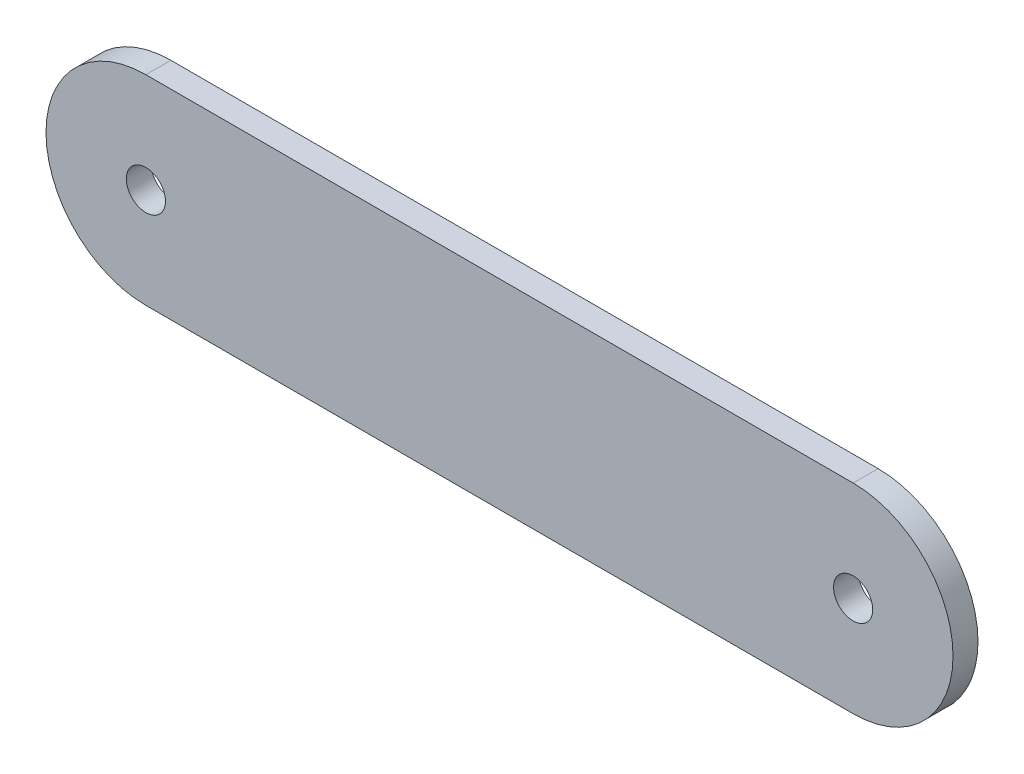
ISO-10303-21;
HEADER;
FILE_DESCRIPTION(('STEP AP214'),'2;1');
FILE_NAME('part.step','',(''),(''),'','','');
FILE_SCHEMA(('AUTOMOTIVE_DESIGN { 1 0 10303 214 1 1 1 1 }'));
ENDSEC;
DATA;
#1=APPLICATION_CONTEXT('core data for automotive mechanical design processes');
#2=APPLICATION_PROTOCOL_DEFINITION('international standard','automotive_design',2000,#1);
#3=PRODUCT_CONTEXT('',#1,'mechanical');
#4=PRODUCT('Part','Part','',(#3));
#5=PRODUCT_RELATED_PRODUCT_CATEGORY('part','',(#4));
#6=PRODUCT_DEFINITION_FORMATION('','',#4);
#7=PRODUCT_DEFINITION_CONTEXT('part definition',#1,'design');
#8=PRODUCT_DEFINITION('design','',#6,#7);
#9=PRODUCT_DEFINITION_SHAPE('','',#8);
#10=(LENGTH_UNIT() NAMED_UNIT(*) SI_UNIT(.MILLI.,.METRE.));
#11=(NAMED_UNIT(*) PLANE_ANGLE_UNIT() SI_UNIT($,.RADIAN.));
#12=(NAMED_UNIT(*) SI_UNIT($,.STERADIAN.) SOLID_ANGLE_UNIT());
#13=UNCERTAINTY_MEASURE_WITH_UNIT(LENGTH_MEASURE(1.E-05),#10,'distance_accuracy_value','');
#14=(GEOMETRIC_REPRESENTATION_CONTEXT(3) GLOBAL_UNCERTAINTY_ASSIGNED_CONTEXT((#13)) GLOBAL_UNIT_ASSIGNED_CONTEXT((#10,
#11,#12)) REPRESENTATION_CONTEXT('',''));
#15=CARTESIAN_POINT('',(0.,0.,0.));
#16=DIRECTION('',(0.,0.,1.));
#17=DIRECTION('',(1.,0.,0.));
#18=AXIS2_PLACEMENT_3D('',#15,#16,#17);
#19=CARTESIAN_POINT('',(49.1513028257687,-1.99820795430557E-13,3.175));
#20=DIRECTION('',(0.,0.,-1.));
#21=DIRECTION('',(-1.,0.,0.));
#22=AXIS2_PLACEMENT_3D('',#19,#20,#21);
#23=CYLINDRICAL_SURFACE('',#22,12.7000000000002);
#24=CARTESIAN_POINT('',(49.1513028257687,-1.99820795430557E-13,0.));
#25=DIRECTION('',(0.,0.,1.));
#26=DIRECTION('',(1.,0.,0.));
#27=AXIS2_PLACEMENT_3D('',#24,#25,#26);
#28=CIRCLE('',#27,12.7000000000002);
#29=CARTESIAN_POINT('',(49.1512996272687,-12.7,0.));
#30=VERTEX_POINT('',#29);
#31=CARTESIAN_POINT('',(49.1513028257687,12.7,0.));
#32=VERTEX_POINT('',#31);
#33=EDGE_CURVE('E113',#30,#32,#28,.T.);
#34=ORIENTED_EDGE('',*,*,#33,.T.);
#35=DIRECTION('',(0.,0.,-1.));
#36=VECTOR('',#35,1.);
#37=CARTESIAN_POINT('',(49.1513028257687,12.7,3.175));
#38=LINE('',#37,#36);
#39=CARTESIAN_POINT('',(49.1513028257687,12.7,3.175));
#40=VERTEX_POINT('',#39);
#41=EDGE_CURVE('E11',#40,#32,#38,.T.);
#42=ORIENTED_EDGE('',*,*,#41,.F.);
#43=CARTESIAN_POINT('',(49.1513028257687,-1.99820795430557E-13,3.175));
#44=DIRECTION('',(0.,0.,1.));
#45=DIRECTION('',(1.,0.,0.));
#46=AXIS2_PLACEMENT_3D('',#43,#44,#45);
#47=CIRCLE('',#46,12.7000000000002);
#48=CARTESIAN_POINT('',(49.1512996272687,-12.7,3.175));
#49=VERTEX_POINT('',#48);
#50=EDGE_CURVE('E97',#49,#40,#47,.T.);
#51=ORIENTED_EDGE('',*,*,#50,.F.);
#52=DIRECTION('',(0.,0.,-1.));
#53=VECTOR('',#52,1.);
#54=CARTESIAN_POINT('',(49.1512996272687,-12.7,3.175));
#55=LINE('',#54,#53);
#56=EDGE_CURVE('E109',#49,#30,#55,.T.);
#57=ORIENTED_EDGE('',*,*,#56,.T.);
#58=EDGE_LOOP('',(#34,#42,#51,#57));
#59=FACE_BOUND('',#58,.T.);
#60=ADVANCED_FACE('F45',(#59),#23,.T.);
#61=CARTESIAN_POINT('',(49.1513028257687,12.7,3.175));
#62=DIRECTION('',(0.,-1.,0.));
#63=DIRECTION('',(1.,0.,0.));
#64=AXIS2_PLACEMENT_3D('',#61,#62,#63);
#65=PLANE('',#64);
#66=DIRECTION('',(-1.,0.,0.));
#67=VECTOR('',#66,1.);
#68=CARTESIAN_POINT('',(49.1513028257687,12.7,0.));
#69=LINE('',#68,#67);
#70=CARTESIAN_POINT('',(-40.7646971742313,12.7,0.));
#71=VERTEX_POINT('',#70);
#72=EDGE_CURVE('E102',#32,#71,#69,.T.);
#73=ORIENTED_EDGE('',*,*,#72,.T.);
#74=DIRECTION('',(0.,0.,-1.));
#75=VECTOR('',#74,1.);
#76=CARTESIAN_POINT('',(-40.7646971742313,12.7,3.175));
#77=LINE('',#76,#75);
#78=CARTESIAN_POINT('',(-40.7646971742313,12.7,3.175));
#79=VERTEX_POINT('',#78);
#80=EDGE_CURVE('E54',#79,#71,#77,.T.);
#81=ORIENTED_EDGE('',*,*,#80,.F.);
#82=DIRECTION('',(-1.,0.,0.));
#83=VECTOR('',#82,1.);
#84=CARTESIAN_POINT('',(49.1513028257687,12.7,3.175));
#85=LINE('',#84,#83);
#86=EDGE_CURVE('E92',#40,#79,#85,.T.);
#87=ORIENTED_EDGE('',*,*,#86,.F.);
#88=ORIENTED_EDGE('',*,*,#41,.T.);
#89=EDGE_LOOP('',(#73,#81,#87,#88));
#90=FACE_BOUND('',#89,.T.);
#91=ADVANCED_FACE('F101',(#90),#65,.F.);
#92=CARTESIAN_POINT('',(-40.7646971742313,0.,3.175));
#93=DIRECTION('',(0.,0.,-1.));
#94=DIRECTION('',(-1.,0.,0.));
#95=AXIS2_PLACEMENT_3D('',#92,#93,#94);
#96=CYLINDRICAL_SURFACE('',#95,12.7);
#97=CARTESIAN_POINT('',(-40.7646971742313,0.,0.));
#98=DIRECTION('',(0.,0.,1.));
#99=DIRECTION('',(1.,0.,0.));
#100=AXIS2_PLACEMENT_3D('',#97,#98,#99);
#101=CIRCLE('',#100,12.7);
#102=CARTESIAN_POINT('',(-40.7646971742313,-12.7,0.));
#103=VERTEX_POINT('',#102);
#104=EDGE_CURVE('E79',#71,#103,#101,.T.);
#105=ORIENTED_EDGE('',*,*,#104,.T.);
#106=DIRECTION('',(0.,0.,-1.));
#107=VECTOR('',#106,1.);
#108=CARTESIAN_POINT('',(-40.7646971742313,-12.7,3.175));
#109=LINE('',#108,#107);
#110=CARTESIAN_POINT('',(-40.7646971742313,-12.7,3.175));
#111=VERTEX_POINT('',#110);
#112=EDGE_CURVE('E104',#111,#103,#109,.T.);
#113=ORIENTED_EDGE('',*,*,#112,.F.);
#114=CARTESIAN_POINT('',(-40.7646971742313,0.,3.175));
#115=DIRECTION('',(0.,0.,1.));
#116=DIRECTION('',(1.,0.,0.));
#117=AXIS2_PLACEMENT_3D('',#114,#115,#116);
#118=CIRCLE('',#117,12.7);
#119=EDGE_CURVE('E95',#79,#111,#118,.T.);
#120=ORIENTED_EDGE('',*,*,#119,.F.);
#121=ORIENTED_EDGE('',*,*,#80,.T.);
#122=EDGE_LOOP('',(#105,#113,#120,#121));
#123=FACE_BOUND('',#122,.T.);
#124=ADVANCED_FACE('F105',(#123),#96,.T.);
#125=CARTESIAN_POINT('',(49.1512996272687,-12.7,3.175));
#126=DIRECTION('',(0.,1.,0.));
#127=DIRECTION('',(0.,0.,1.));
#128=AXIS2_PLACEMENT_3D('',#125,#126,#127);
#129=PLANE('',#128);
#130=DIRECTION('',(1.,0.,0.));
#131=VECTOR('',#130,1.);
#132=CARTESIAN_POINT('',(49.1512996272687,-12.7,0.));
#133=LINE('',#132,#131);
#134=EDGE_CURVE('E85',#103,#30,#133,.T.);
#135=ORIENTED_EDGE('',*,*,#134,.T.);
#136=ORIENTED_EDGE('',*,*,#56,.F.);
#137=DIRECTION('',(1.,0.,0.));
#138=VECTOR('',#137,1.);
#139=CARTESIAN_POINT('',(49.1512996272687,-12.7,3.175));
#140=LINE('',#139,#138);
#141=EDGE_CURVE('E62',#111,#49,#140,.T.);
#142=ORIENTED_EDGE('',*,*,#141,.F.);
#143=ORIENTED_EDGE('',*,*,#112,.T.);
#144=EDGE_LOOP('',(#135,#136,#142,#143));
#145=FACE_BOUND('',#144,.T.);
#146=ADVANCED_FACE('F127',(#145),#129,.F.);
#147=CARTESIAN_POINT('',(49.1513028257687,-1.99820795430557E-13,3.175));
#148=DIRECTION('',(0.,0.,1.));
#149=DIRECTION('',(1.,0.,0.));
#150=AXIS2_PLACEMENT_3D('',#147,#148,#149);
#151=PLANE('',#150);
#152=CARTESIAN_POINT('',(-40.7646971742313,0.,3.175));
#153=DIRECTION('',(0.,0.,1.));
#154=DIRECTION('',(1.,0.,0.));
#155=AXIS2_PLACEMENT_3D('',#152,#153,#154);
#156=CIRCLE('',#155,2.48919999999999);
#157=CARTESIAN_POINT('',(-38.2754971742313,0.,3.175));
#158=VERTEX_POINT('',#157);
#159=EDGE_CURVE('E145',#158,#158,#156,.T.);
#160=ORIENTED_EDGE('',*,*,#159,.F.);
#161=EDGE_LOOP('',(#160));
#162=FACE_BOUND('',#161,.T.);
#163=CARTESIAN_POINT('',(49.1513028257687,-1.99820795430557E-13,3.175));
#164=DIRECTION('',(0.,0.,1.));
#165=DIRECTION('',(1.,0.,0.));
#166=AXIS2_PLACEMENT_3D('',#163,#164,#165);
#167=CIRCLE('',#166,2.48919999999999);
#168=CARTESIAN_POINT('',(51.6405028257687,-1.99820795430557E-13,3.175));
#169=VERTEX_POINT('',#168);
#170=EDGE_CURVE('E137',#169,#169,#167,.T.);
#171=ORIENTED_EDGE('',*,*,#170,.F.);
#172=EDGE_LOOP('',(#171));
#173=FACE_BOUND('',#172,.T.);
#174=ORIENTED_EDGE('',*,*,#50,.T.);
#175=ORIENTED_EDGE('',*,*,#86,.T.);
#176=ORIENTED_EDGE('',*,*,#119,.T.);
#177=ORIENTED_EDGE('',*,*,#141,.T.);
#178=EDGE_LOOP('',(#174,#175,#176,#177));
#179=FACE_BOUND('',#178,.T.);
#180=ADVANCED_FACE('F93',(#162,#173,#179),#151,.T.);
#181=CARTESIAN_POINT('',(49.1513028257687,-1.99820795430557E-13,0.));
#182=DIRECTION('',(0.,0.,1.));
#183=DIRECTION('',(1.,0.,0.));
#184=AXIS2_PLACEMENT_3D('',#181,#182,#183);
#185=PLANE('',#184);
#186=CARTESIAN_POINT('',(-40.7646971742313,0.,0.));
#187=DIRECTION('',(0.,0.,1.));
#188=DIRECTION('',(1.,0.,0.));
#189=AXIS2_PLACEMENT_3D('',#186,#187,#188);
#190=CIRCLE('',#189,2.4892);
#191=CARTESIAN_POINT('',(-38.2754971742313,0.,0.));
#192=VERTEX_POINT('',#191);
#193=EDGE_CURVE('E141',#192,#192,#190,.T.);
#194=ORIENTED_EDGE('',*,*,#193,.T.);
#195=EDGE_LOOP('',(#194));
#196=FACE_BOUND('',#195,.T.);
#197=CARTESIAN_POINT('',(49.1513028257687,-1.99820795430557E-13,0.));
#198=DIRECTION('',(0.,0.,1.));
#199=DIRECTION('',(1.,0.,0.));
#200=AXIS2_PLACEMENT_3D('',#197,#198,#199);
#201=CIRCLE('',#200,2.4892);
#202=CARTESIAN_POINT('',(51.6405028257687,-1.99820795430557E-13,0.));
#203=VERTEX_POINT('',#202);
#204=EDGE_CURVE('E117',#203,#203,#201,.T.);
#205=ORIENTED_EDGE('',*,*,#204,.T.);
#206=EDGE_LOOP('',(#205));
#207=FACE_BOUND('',#206,.T.);
#208=ORIENTED_EDGE('',*,*,#33,.F.);
#209=ORIENTED_EDGE('',*,*,#134,.F.);
#210=ORIENTED_EDGE('',*,*,#104,.F.);
#211=ORIENTED_EDGE('',*,*,#72,.F.);
#212=EDGE_LOOP('',(#208,#209,#210,#211));
#213=FACE_BOUND('',#212,.T.);
#214=ADVANCED_FACE('F130',(#196,#207,#213),#185,.F.);
#215=CARTESIAN_POINT('',(49.1513028257687,-1.99820795430557E-13,3.175));
#216=DIRECTION('',(0.,0.,1.));
#217=DIRECTION('',(1.,0.,0.));
#218=AXIS2_PLACEMENT_3D('',#215,#216,#217);
#219=CYLINDRICAL_SURFACE('',#218,2.48919999999999);
#220=ORIENTED_EDGE('',*,*,#204,.F.);
#221=EDGE_LOOP('',(#220));
#222=FACE_BOUND('',#221,.T.);
#223=ORIENTED_EDGE('',*,*,#170,.T.);
#224=EDGE_LOOP('',(#223));
#225=FACE_BOUND('',#224,.T.);
#226=ADVANCED_FACE('F157',(#222,#225),#219,.F.);
#227=CARTESIAN_POINT('',(-40.7646971742313,0.,3.175));
#228=DIRECTION('',(0.,0.,1.));
#229=DIRECTION('',(1.,0.,0.));
#230=AXIS2_PLACEMENT_3D('',#227,#228,#229);
#231=CYLINDRICAL_SURFACE('',#230,2.48919999999999);
#232=ORIENTED_EDGE('',*,*,#193,.F.);
#233=EDGE_LOOP('',(#232));
#234=FACE_BOUND('',#233,.T.);
#235=ORIENTED_EDGE('',*,*,#159,.T.);
#236=EDGE_LOOP('',(#235));
#237=FACE_BOUND('',#236,.T.);
#238=ADVANCED_FACE('F150',(#234,#237),#231,.F.);
#239=CLOSED_SHELL('',(#60,#91,#124,#146,#180,#214,#226,#238));
#240=MANIFOLD_SOLID_BREP('B2',#239);
#241=ADVANCED_BREP_SHAPE_REPRESENTATION('',(#18,#240),#14);
#242=SHAPE_DEFINITION_REPRESENTATION(#9,#241);
ENDSEC;
END-ISO-10303-21;
